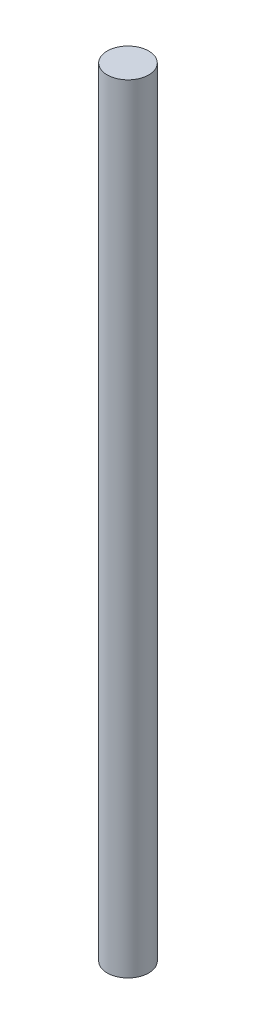
ISO-10303-21;
HEADER;
FILE_DESCRIPTION(('STEP AP214'),'2;1');
FILE_NAME('part.step','',(''),(''),'','','');
FILE_SCHEMA(('AUTOMOTIVE_DESIGN { 1 0 10303 214 1 1 1 1 }'));
ENDSEC;
DATA;
#1=APPLICATION_CONTEXT('core data for automotive mechanical design processes');
#2=APPLICATION_PROTOCOL_DEFINITION('international standard','automotive_design',2000,#1);
#3=PRODUCT_CONTEXT('',#1,'mechanical');
#4=PRODUCT('Part','Part','',(#3));
#5=PRODUCT_RELATED_PRODUCT_CATEGORY('part','',(#4));
#6=PRODUCT_DEFINITION_FORMATION('','',#4);
#7=PRODUCT_DEFINITION_CONTEXT('part definition',#1,'design');
#8=PRODUCT_DEFINITION('design','',#6,#7);
#9=PRODUCT_DEFINITION_SHAPE('','',#8);
#10=(LENGTH_UNIT() NAMED_UNIT(*) SI_UNIT(.MILLI.,.METRE.));
#11=(NAMED_UNIT(*) PLANE_ANGLE_UNIT() SI_UNIT($,.RADIAN.));
#12=(NAMED_UNIT(*) SI_UNIT($,.STERADIAN.) SOLID_ANGLE_UNIT());
#13=UNCERTAINTY_MEASURE_WITH_UNIT(LENGTH_MEASURE(1.E-05),#10,'distance_accuracy_value','');
#14=(GEOMETRIC_REPRESENTATION_CONTEXT(3) GLOBAL_UNCERTAINTY_ASSIGNED_CONTEXT((#13)) GLOBAL_UNIT_ASSIGNED_CONTEXT((#10,
#11,#12)) REPRESENTATION_CONTEXT('',''));
#15=CARTESIAN_POINT('',(0.,0.,0.));
#16=DIRECTION('',(0.,0.,1.));
#17=DIRECTION('',(1.,0.,0.));
#18=AXIS2_PLACEMENT_3D('',#15,#16,#17);
#19=CARTESIAN_POINT('',(0.,150.,0.));
#20=DIRECTION('',(0.,-1.,0.));
#21=DIRECTION('',(0.,0.,-1.));
#22=AXIS2_PLACEMENT_3D('',#19,#20,#21);
#23=CYLINDRICAL_SURFACE('',#22,4.);
#24=CARTESIAN_POINT('',(0.,150.,0.));
#25=DIRECTION('',(0.,1.,0.));
#26=DIRECTION('',(0.,0.,1.));
#27=AXIS2_PLACEMENT_3D('',#24,#25,#26);
#28=CIRCLE('',#27,4.);
#29=CARTESIAN_POINT('',(0.,150.,4.));
#30=VERTEX_POINT('',#29);
#31=EDGE_CURVE('E10',#30,#30,#28,.T.);
#32=ORIENTED_EDGE('',*,*,#31,.F.);
#33=EDGE_LOOP('',(#32));
#34=FACE_BOUND('',#33,.T.);
#35=CARTESIAN_POINT('',(0.,0.,0.));
#36=DIRECTION('',(0.,1.,0.));
#37=DIRECTION('',(0.,0.,1.));
#38=AXIS2_PLACEMENT_3D('',#35,#36,#37);
#39=CIRCLE('',#38,4.);
#40=CARTESIAN_POINT('',(0.,0.,4.));
#41=VERTEX_POINT('',#40);
#42=EDGE_CURVE('E40',#41,#41,#39,.T.);
#43=ORIENTED_EDGE('',*,*,#42,.T.);
#44=EDGE_LOOP('',(#43));
#45=FACE_BOUND('',#44,.T.);
#46=ADVANCED_FACE('F37',(#34,#45),#23,.T.);
#47=CARTESIAN_POINT('',(0.,150.,0.));
#48=DIRECTION('',(0.,1.,0.));
#49=DIRECTION('',(0.,0.,1.));
#50=AXIS2_PLACEMENT_3D('',#47,#48,#49);
#51=PLANE('',#50);
#52=ORIENTED_EDGE('',*,*,#31,.T.);
#53=EDGE_LOOP('',(#52));
#54=FACE_BOUND('',#53,.T.);
#55=ADVANCED_FACE('F52',(#54),#51,.T.);
#56=CARTESIAN_POINT('',(0.,0.,0.));
#57=DIRECTION('',(0.,1.,0.));
#58=DIRECTION('',(0.,0.,1.));
#59=AXIS2_PLACEMENT_3D('',#56,#57,#58);
#60=PLANE('',#59);
#61=ORIENTED_EDGE('',*,*,#42,.F.);
#62=EDGE_LOOP('',(#61));
#63=FACE_BOUND('',#62,.T.);
#64=ADVANCED_FACE('F50',(#63),#60,.F.);
#65=CLOSED_SHELL('',(#46,#55,#64));
#66=MANIFOLD_SOLID_BREP('B2',#65);
#67=ADVANCED_BREP_SHAPE_REPRESENTATION('',(#18,#66),#14);
#68=SHAPE_DEFINITION_REPRESENTATION(#9,#67);
ENDSEC;
END-ISO-10303-21;
